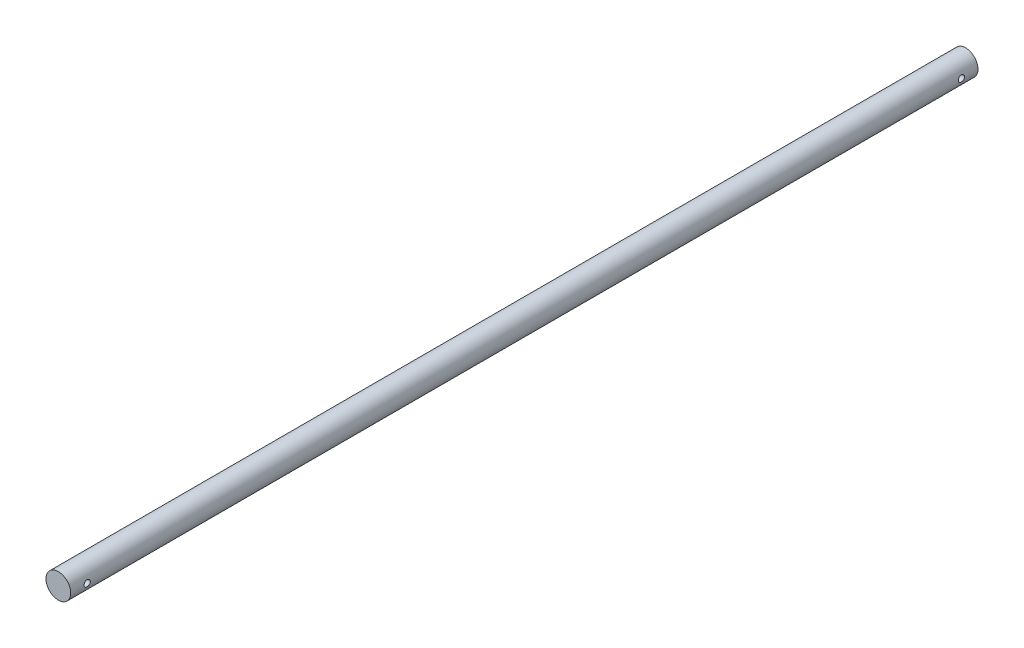
ISO-10303-21;
HEADER;
FILE_DESCRIPTION(('STEP AP214'),'2;1');
FILE_NAME('part.step','',(''),(''),'','','');
FILE_SCHEMA(('AUTOMOTIVE_DESIGN { 1 0 10303 214 1 1 1 1 }'));
ENDSEC;
DATA;
#1=APPLICATION_CONTEXT('core data for automotive mechanical design processes');
#2=APPLICATION_PROTOCOL_DEFINITION('international standard','automotive_design',2000,#1);
#3=PRODUCT_CONTEXT('',#1,'mechanical');
#4=PRODUCT('Part','Part','',(#3));
#5=PRODUCT_RELATED_PRODUCT_CATEGORY('part','',(#4));
#6=PRODUCT_DEFINITION_FORMATION('','',#4);
#7=PRODUCT_DEFINITION_CONTEXT('part definition',#1,'design');
#8=PRODUCT_DEFINITION('design','',#6,#7);
#9=PRODUCT_DEFINITION_SHAPE('','',#8);
#10=(LENGTH_UNIT() NAMED_UNIT(*) SI_UNIT(.MILLI.,.METRE.));
#11=(NAMED_UNIT(*) PLANE_ANGLE_UNIT() SI_UNIT($,.RADIAN.));
#12=(NAMED_UNIT(*) SI_UNIT($,.STERADIAN.) SOLID_ANGLE_UNIT());
#13=UNCERTAINTY_MEASURE_WITH_UNIT(LENGTH_MEASURE(1.E-05),#10,'distance_accuracy_value','');
#14=(GEOMETRIC_REPRESENTATION_CONTEXT(3) GLOBAL_UNCERTAINTY_ASSIGNED_CONTEXT((#13)) GLOBAL_UNIT_ASSIGNED_CONTEXT((#10,
#11,#12)) REPRESENTATION_CONTEXT('',''));
#15=CARTESIAN_POINT('',(0.,0.,0.));
#16=DIRECTION('',(0.,0.,1.));
#17=DIRECTION('',(1.,0.,0.));
#18=AXIS2_PLACEMENT_3D('',#15,#16,#17);
#19=CARTESIAN_POINT('',(0.,0.,220.));
#20=DIRECTION('',(0.,0.,-1.));
#21=DIRECTION('',(-1.,0.,0.));
#22=AXIS2_PLACEMENT_3D('',#19,#20,#21);
#23=CYLINDRICAL_SURFACE('',#22,3.);
#24=CARTESIAN_POINT('',(-3.,0.,4.74999999999995));
#25=CARTESIAN_POINT('',(-2.99999929934006,-0.041438044334868,4.74999883713087));
#26=CARTESIAN_POINT('',(-2.99913289065914,-0.0828890789153865,4.74655422461309));
#27=CARTESIAN_POINT('',(-2.99576056914946,-0.164603161885271,4.73288742434651));
#28=CARTESIAN_POINT('',(-2.99325372709984,-0.204865523435372,4.72266139523108));
#29=CARTESIAN_POINT('',(-2.9868781316602,-0.283010436091287,4.69578037326895));
#30=CARTESIAN_POINT('',(-2.98301101421043,-0.320895781715,4.67913310064236));
#31=CARTESIAN_POINT('',(-2.97432671903797,-0.393336065952212,4.63990930497759));
#32=CARTESIAN_POINT('',(-2.96950950927025,-0.427890892174379,4.61733258194053));
#33=CARTESIAN_POINT('',(-2.95933706795901,-0.49340096365046,4.56639960517289));
#34=CARTESIAN_POINT('',(-2.95397353574266,-0.524277845030537,4.53794421252041));
#35=CARTESIAN_POINT('',(-2.94336810058765,-0.580874463601653,4.47627389754554));
#36=CARTESIAN_POINT('',(-2.93812621144174,-0.606593618474568,4.44305843852675));
#37=CARTESIAN_POINT('',(-2.92827387849855,-0.652513271399516,4.37220238663128));
#38=CARTESIAN_POINT('',(-2.92367397235303,-0.672626107962678,4.3345033845948));
#39=CARTESIAN_POINT('',(-2.91574747406112,-0.706198454275264,4.25612579417082));
#40=CARTESIAN_POINT('',(-2.91242067836394,-0.719659027719666,4.21544768333712));
#41=CARTESIAN_POINT('',(-2.90750238358775,-0.739277418402145,4.13312825089876));
#42=CARTESIAN_POINT('',(-2.90587745537713,-0.745576134166669,4.0915225519751));
#43=CARTESIAN_POINT('',(-2.9044468126887,-0.751130887533926,4.00781571549301));
#44=CARTESIAN_POINT('',(-2.90464080224322,-0.750388070908989,3.96571465965069));
#45=CARTESIAN_POINT('',(-2.90679602748309,-0.74199326231964,3.88329209612776));
#46=CARTESIAN_POINT('',(-2.9087143150094,-0.73450917009526,3.84295218926745));
#47=CARTESIAN_POINT('',(-2.91403354838242,-0.713112093451554,3.76411947454435));
#48=CARTESIAN_POINT('',(-2.91743459985348,-0.699198651034712,3.72562679848551));
#49=CARTESIAN_POINT('',(-2.92537556952093,-0.665194738968577,3.65113099187397));
#50=CARTESIAN_POINT('',(-2.92992663734711,-0.645043333616456,3.61515691410522));
#51=CARTESIAN_POINT('',(-2.93964855423193,-0.599178138007478,3.54704064512158));
#52=CARTESIAN_POINT('',(-2.94481951167368,-0.57346337440442,3.51489912596637));
#53=CARTESIAN_POINT('',(-2.95537940269891,-0.516331712340609,3.4543981921528));
#54=CARTESIAN_POINT('',(-2.96077034738986,-0.48477312908293,3.42617275496933));
#55=CARTESIAN_POINT('',(-2.97102982789393,-0.41730595875185,3.37538937876805));
#56=CARTESIAN_POINT('',(-2.97589834774708,-0.381397238853972,3.35283161286822));
#57=CARTESIAN_POINT('',(-2.98458866047091,-0.306057944340696,3.31397470688781));
#58=CARTESIAN_POINT('',(-2.98840680063863,-0.266615696604312,3.29769732987279));
#59=CARTESIAN_POINT('',(-2.99453958495709,-0.185438004071442,3.27204134714521));
#60=CARTESIAN_POINT('',(-2.99685451669641,-0.143702999575243,3.26266142179093));
#61=CARTESIAN_POINT('',(-2.99967749635687,-0.0602699851950137,3.25127121722058));
#62=CARTESIAN_POINT('',(-3.00023026754139,-0.0185983599941051,3.24907848696235));
#63=CARTESIAN_POINT('',(-2.99959402407225,0.0645164374007539,3.25162450102774));
#64=CARTESIAN_POINT('',(-2.99840516620923,0.105959629822297,3.25636262139957));
#65=CARTESIAN_POINT('',(-2.99444790563679,0.186807134388246,3.27248545419569));
#66=CARTESIAN_POINT('',(-2.99170317092906,0.226232559484377,3.28377063173849));
#67=CARTESIAN_POINT('',(-2.98494353317067,0.302628646226255,3.31255354201422));
#68=CARTESIAN_POINT('',(-2.98092850184946,0.339599059516317,3.33005190215658));
#69=CARTESIAN_POINT('',(-2.97196653963155,0.410761567214924,3.37111806443736));
#70=CARTESIAN_POINT('',(-2.96700433683466,0.444892720917915,3.39478805619838));
#71=CARTESIAN_POINT('',(-2.9567225459371,0.508763306821623,3.44739495439848));
#72=CARTESIAN_POINT('',(-2.95140289625852,0.538501979486504,3.47633276980845));
#73=CARTESIAN_POINT('',(-2.94084478480386,0.593495284036365,3.53950098042223));
#74=CARTESIAN_POINT('',(-2.93561152093641,0.618621933811016,3.57384385150121));
#75=CARTESIAN_POINT('',(-2.92596439188619,0.662755379506349,3.64636631723286));
#76=CARTESIAN_POINT('',(-2.92155049033513,0.681762447078968,3.68454574147988));
#77=CARTESIAN_POINT('',(-2.91409047367333,0.712975710304646,3.76345286120654));
#78=CARTESIAN_POINT('',(-2.91103627645953,0.725222198327033,3.804163814172));
#79=CARTESIAN_POINT('',(-2.90663372045092,0.74267282997689,3.88715481894455));
#80=CARTESIAN_POINT('',(-2.90528498859968,0.747878513739329,3.92943452551624));
#81=CARTESIAN_POINT('',(-2.90447450601978,0.751019295166998,4.0130605119276));
#82=CARTESIAN_POINT('',(-2.90495966364132,0.749158948890059,4.05439871756236));
#83=CARTESIAN_POINT('',(-2.90763954503921,0.738688639156434,4.13615194433399));
#84=CARTESIAN_POINT('',(-2.90983423445928,0.730078811343385,4.17656698400682));
#85=CARTESIAN_POINT('',(-2.91565630341361,0.706465659721397,4.2551042295327));
#86=CARTESIAN_POINT('',(-2.91927507618155,0.691500702340188,4.2932386526201));
#87=CARTESIAN_POINT('',(-2.92753877862414,0.655632456802535,4.36648269135685));
#88=CARTESIAN_POINT('',(-2.93218385060387,0.634728345017094,4.40159188659346));
#89=CARTESIAN_POINT('',(-2.94212817131756,0.586933874318568,4.46877731450101));
#90=CARTESIAN_POINT('',(-2.94744132415878,0.559901581456128,4.50075053671198));
#91=CARTESIAN_POINT('',(-2.95804013623143,0.500894685594868,4.5597735223977));
#92=CARTESIAN_POINT('',(-2.9633257886353,0.468918910630573,4.58682211505648));
#93=CARTESIAN_POINT('',(-2.97338827823832,0.400233793351294,4.6357056542823));
#94=CARTESIAN_POINT('',(-2.97815416682934,0.363449211158192,4.65743730683579));
#95=CARTESIAN_POINT('',(-2.98652462487559,0.286633029755236,4.69437373147027));
#96=CARTESIAN_POINT('',(-2.99013002599891,0.246603781718369,4.70958318032426));
#97=CARTESIAN_POINT('',(-2.99524029782771,0.172205126621737,4.73078591516483));
#98=CARTESIAN_POINT('',(-2.99701292526345,0.138190085454038,4.73797562152673));
#99=CARTESIAN_POINT('',(-2.99939302615974,0.0694530357681454,4.74758297181096));
#100=CARTESIAN_POINT('',(-3.00000058725447,0.03473108062131,4.7500009746526));
#101=CARTESIAN_POINT('',(-3.,0.,4.74999999999995));
#102=B_SPLINE_CURVE_WITH_KNOTS('',3,(#24,#25,#26,#27,#28,#29,#30,#31,#32,#33,#34,#35,#36,#37,
#38,#39,#40,#41,#42,#43,#44,#45,#46,#47,#48,#49,#50,#51,#52,#53,#54,#55,#56,#57,#58,#59,#60,#61,
#62,#63,#64,#65,#66,#67,#68,#69,#70,#71,#72,#73,#74,#75,#76,#77,#78,#79,#80,#81,#82,#83,#84,#85,
#86,#87,#88,#89,#90,#91,#92,#93,#94,#95,#96,#97,#98,#99,#100,#101),.UNSPECIFIED.,.T.,.F.,(4,2,2,
2,2,2,2,2,2,2,2,2,2,2,2,2,2,2,2,2,2,2,2,2,2,2,2,2,2,2,2,2,2,2,2,2,2,2,4),(0.,0.124186856235947,
0.248444118881946,0.372552451143046,0.49666497008466,0.623072177185692,0.749493647900305,
0.877793237729029,1.00607230584684,1.13178147549715,1.25747019056348,1.38011248503509,
1.50276351733019,1.62665263936939,1.75056345418081,1.87800750484509,2.00545544779123,
2.13334114504557,2.26120236844321,2.38579154474638,2.51036950556371,2.63310137257018,
2.75584563661145,2.88076793782676,3.00571181504009,3.13372254602238,3.26172759374754,
3.38896127307018,3.51616711626203,3.63971890199306,3.76326820478017,3.88608200279723,
4.0089128406845,4.13494788204954,4.26101284885208,4.38936092749794,4.51761681910675,
4.62171121471074,4.72579778021519),.UNSPECIFIED.);
#103=CARTESIAN_POINT('',(-3.,0.,4.74999999999995));
#104=VERTEX_POINT('',#103);
#105=EDGE_CURVE('E10',#104,#104,#102,.T.);
#106=ORIENTED_EDGE('',*,*,#105,.T.);
#107=EDGE_LOOP('',(#106));
#108=FACE_BOUND('',#107,.T.);
#109=CARTESIAN_POINT('',(3.,0.,3.25));
#110=CARTESIAN_POINT('',(2.99999929934006,-0.0414380443348656,3.25000116286908));
#111=CARTESIAN_POINT('',(2.99913289065914,-0.0828890789153817,3.25344577538689));
#112=CARTESIAN_POINT('',(2.99576056914946,-0.164603161885266,3.2671125756535));
#113=CARTESIAN_POINT('',(2.99325372709984,-0.20486552343537,3.27733860476892));
#114=CARTESIAN_POINT('',(2.9868781316602,-0.283010436091289,3.30421962673104));
#115=CARTESIAN_POINT('',(2.98301101421043,-0.320895781715002,3.32086689935764));
#116=CARTESIAN_POINT('',(2.97432671903797,-0.393336065952213,3.36009069502242));
#117=CARTESIAN_POINT('',(2.96950950927025,-0.42789089217438,3.38266741805947));
#118=CARTESIAN_POINT('',(2.95933706795901,-0.49340096365046,3.43360039482711));
#119=CARTESIAN_POINT('',(2.95397353574266,-0.524277845030536,3.46205578747959));
#120=CARTESIAN_POINT('',(2.94336810058765,-0.580874463601652,3.52372610245446));
#121=CARTESIAN_POINT('',(2.93812621144174,-0.606593618474568,3.55694156147325));
#122=CARTESIAN_POINT('',(2.92827387849855,-0.652513271399516,3.62779761336872));
#123=CARTESIAN_POINT('',(2.92367397235303,-0.672626107962679,3.6654966154052));
#124=CARTESIAN_POINT('',(2.91574747406112,-0.706198454275264,3.74387420582918));
#125=CARTESIAN_POINT('',(2.91242067836394,-0.719659027719667,3.78455231666288));
#126=CARTESIAN_POINT('',(2.90750238358775,-0.739277418402145,3.86687174910124));
#127=CARTESIAN_POINT('',(2.90587745537713,-0.745576134166669,3.9084774480249));
#128=CARTESIAN_POINT('',(2.9044468126887,-0.751130887533926,3.99218428450699));
#129=CARTESIAN_POINT('',(2.90464080224322,-0.750388070908989,4.03428534034931));
#130=CARTESIAN_POINT('',(2.90679602748309,-0.741993262319641,4.11670790387224));
#131=CARTESIAN_POINT('',(2.9087143150094,-0.73450917009526,4.15704781073255));
#132=CARTESIAN_POINT('',(2.91403354838242,-0.713112093451553,4.23588052545565));
#133=CARTESIAN_POINT('',(2.91743459985348,-0.699198651034712,4.27437320151449));
#134=CARTESIAN_POINT('',(2.92537556952093,-0.665194738968577,4.34886900812603));
#135=CARTESIAN_POINT('',(2.92992663734711,-0.645043333616455,4.38484308589478));
#136=CARTESIAN_POINT('',(2.93964855423193,-0.599178138007477,4.45295935487842));
#137=CARTESIAN_POINT('',(2.94481951167368,-0.57346337440442,4.48510087403363));
#138=CARTESIAN_POINT('',(2.9553794026989,-0.516331712340609,4.5456018078472));
#139=CARTESIAN_POINT('',(2.96077034738986,-0.48477312908293,4.57382724503068));
#140=CARTESIAN_POINT('',(2.97102982789393,-0.41730595875185,4.62461062123195));
#141=CARTESIAN_POINT('',(2.97589834774708,-0.381397238853972,4.64716838713178));
#142=CARTESIAN_POINT('',(2.98458866047091,-0.306057944340696,4.68602529311219));
#143=CARTESIAN_POINT('',(2.98840680063863,-0.266615696604312,4.70230267012721));
#144=CARTESIAN_POINT('',(2.99453958495709,-0.185438004071441,4.72795865285479));
#145=CARTESIAN_POINT('',(2.99685451669641,-0.143702999575242,4.73733857820907));
#146=CARTESIAN_POINT('',(2.99967749635687,-0.0602699851950134,4.74872878277942));
#147=CARTESIAN_POINT('',(3.00023026754139,-0.0185983599941048,4.75092151303765));
#148=CARTESIAN_POINT('',(2.99959402407225,0.0645164374007542,4.74837549897226));
#149=CARTESIAN_POINT('',(2.99840516620923,0.105959629822298,4.74363737860043));
#150=CARTESIAN_POINT('',(2.99444790563679,0.186807134388246,4.72751454580431));
#151=CARTESIAN_POINT('',(2.99170317092906,0.226232559484378,4.71622936826151));
#152=CARTESIAN_POINT('',(2.98494353317067,0.302628646226256,4.68744645798578));
#153=CARTESIAN_POINT('',(2.98092850184946,0.339599059516318,4.66994809784341));
#154=CARTESIAN_POINT('',(2.97196653963155,0.410761567214924,4.62888193556264));
#155=CARTESIAN_POINT('',(2.96700433683466,0.444892720917915,4.60521194380162));
#156=CARTESIAN_POINT('',(2.9567225459371,0.508763306821623,4.55260504560152));
#157=CARTESIAN_POINT('',(2.95140289625852,0.538501979486504,4.52366723019155));
#158=CARTESIAN_POINT('',(2.94084478480386,0.593495284036365,4.46049901957777));
#159=CARTESIAN_POINT('',(2.93561152093641,0.618621933811016,4.42615614849879));
#160=CARTESIAN_POINT('',(2.92596439188619,0.662755379506349,4.35363368276714));
#161=CARTESIAN_POINT('',(2.92155049033513,0.681762447078968,4.31545425852012));
#162=CARTESIAN_POINT('',(2.91409047367333,0.712975710304646,4.23654713879346));
#163=CARTESIAN_POINT('',(2.91103627645953,0.725222198327033,4.195836185828));
#164=CARTESIAN_POINT('',(2.90663372045092,0.74267282997689,4.11284518105545));
#165=CARTESIAN_POINT('',(2.90528498859968,0.747878513739329,4.07056547448376));
#166=CARTESIAN_POINT('',(2.90447450601978,0.751019295166997,3.9869394880724));
#167=CARTESIAN_POINT('',(2.90495966364132,0.749158948890059,3.94560128243763));
#168=CARTESIAN_POINT('',(2.90763954503921,0.738688639156434,3.86384805566601));
#169=CARTESIAN_POINT('',(2.90983423445928,0.730078811343385,3.82343301599317));
#170=CARTESIAN_POINT('',(2.91565630341361,0.706465659721397,3.7448957704673));
#171=CARTESIAN_POINT('',(2.91927507618155,0.691500702340188,3.7067613473799));
#172=CARTESIAN_POINT('',(2.92753877862414,0.655632456802535,3.63351730864315));
#173=CARTESIAN_POINT('',(2.93218385060387,0.634728345017094,3.59840811340654));
#174=CARTESIAN_POINT('',(2.94212817131756,0.586933874318568,3.53122268549899));
#175=CARTESIAN_POINT('',(2.94744132415879,0.559901581456127,3.49924946328802));
#176=CARTESIAN_POINT('',(2.95804013623143,0.500894685594868,3.4402264776023));
#177=CARTESIAN_POINT('',(2.9633257886353,0.468918910630573,3.41317788494352));
#178=CARTESIAN_POINT('',(2.97338827823831,0.400233793351295,3.3642943457177));
#179=CARTESIAN_POINT('',(2.97815416682934,0.363449211158193,3.34256269316421));
#180=CARTESIAN_POINT('',(2.98652462487559,0.286633029755237,3.30562626852973));
#181=CARTESIAN_POINT('',(2.99013002599891,0.246603781718369,3.29041681967573));
#182=CARTESIAN_POINT('',(2.99524029782771,0.172205126621736,3.26921408483517));
#183=CARTESIAN_POINT('',(2.99701292526345,0.138190085454034,3.26202437847328));
#184=CARTESIAN_POINT('',(2.99939302615974,0.0694530357681415,3.25241702818903));
#185=CARTESIAN_POINT('',(3.00000058725447,0.0347310806213081,3.24999902534735));
#186=CARTESIAN_POINT('',(3.,0.,3.25));
#187=B_SPLINE_CURVE_WITH_KNOTS('',3,(#109,#110,#111,#112,#113,#114,#115,#116,#117,#118,#119,
#120,#121,#122,#123,#124,#125,#126,#127,#128,#129,#130,#131,#132,#133,#134,#135,#136,#137,#138,
#139,#140,#141,#142,#143,#144,#145,#146,#147,#148,#149,#150,#151,#152,#153,#154,#155,#156,#157,
#158,#159,#160,#161,#162,#163,#164,#165,#166,#167,#168,#169,#170,#171,#172,#173,#174,#175,#176,
#177,#178,#179,#180,#181,#182,#183,#184,#185,#186),.UNSPECIFIED.,.T.,.F.,(4,2,2,2,2,2,2,2,2,2,2,
2,2,2,2,2,2,2,2,2,2,2,2,2,2,2,2,2,2,2,2,2,2,2,2,2,2,2,4),(0.,0.124186856235945,0.24844411888195,
0.372552451143053,0.496664970084664,0.623072177185696,0.74949364790031,0.877793237729035,
1.00607230584684,1.13178147549715,1.25747019056348,1.38011248503509,1.50276351733019,
1.6266526393694,1.75056345418081,1.8780075048451,2.00545544779124,2.13334114504557,
2.26120236844321,2.38579154474638,2.51036950556371,2.63310137257019,2.75584563661145,
2.88076793782676,3.0057118150401,3.13372254602238,3.26172759374754,3.38896127307018,
3.51616711626204,3.63971890199306,3.76326820478017,3.88608200279724,4.00891284068451,
4.13494788204955,4.26101284885209,4.38936092749794,4.51761681910675,4.62171121471075,
4.7257977802152),.UNSPECIFIED.);
#188=CARTESIAN_POINT('',(3.,0.,3.25));
#189=VERTEX_POINT('',#188);
#190=EDGE_CURVE('E49',#189,#189,#187,.T.);
#191=ORIENTED_EDGE('',*,*,#190,.T.);
#192=EDGE_LOOP('',(#191));
#193=FACE_BOUND('',#192,.T.);
#194=CARTESIAN_POINT('',(-3.,0.,216.75));
#195=CARTESIAN_POINT('',(-2.99999929934006,-0.0414380443348669,216.749998837131));
#196=CARTESIAN_POINT('',(-2.99913289065914,-0.0828890789153841,216.746554224613));
#197=CARTESIAN_POINT('',(-2.99576056914946,-0.16460316188527,216.732887424347));
#198=CARTESIAN_POINT('',(-2.99325372709984,-0.204865523435374,216.722661395231));
#199=CARTESIAN_POINT('',(-2.9868781316602,-0.283010436091293,216.695780373269));
#200=CARTESIAN_POINT('',(-2.98301101421043,-0.320895781715006,216.679133100642));
#201=CARTESIAN_POINT('',(-2.97432671903796,-0.393336065952223,216.639909304978));
#202=CARTESIAN_POINT('',(-2.96950950927025,-0.427890892174393,216.617332581941));
#203=CARTESIAN_POINT('',(-2.959337067959,-0.493400963650475,216.566399605173));
#204=CARTESIAN_POINT('',(-2.95397353574266,-0.52427784503055,216.53794421252));
#205=CARTESIAN_POINT('',(-2.94336810058764,-0.580874463601666,216.476273897546));
#206=CARTESIAN_POINT('',(-2.93812621144174,-0.606593618474581,216.443058438527));
#207=CARTESIAN_POINT('',(-2.92827387849855,-0.652513271399534,216.372202386631));
#208=CARTESIAN_POINT('',(-2.92367397235302,-0.6726261079627,216.334503384595));
#209=CARTESIAN_POINT('',(-2.91574747406111,-0.706198454275284,216.256125794171));
#210=CARTESIAN_POINT('',(-2.91242067836394,-0.719659027719681,216.215447683337));
#211=CARTESIAN_POINT('',(-2.90750238358775,-0.739277418402156,216.133128250899));
#212=CARTESIAN_POINT('',(-2.90587745537713,-0.745576134166681,216.091522551975));
#213=CARTESIAN_POINT('',(-2.9044468126887,-0.75113088753394,216.007815715493));
#214=CARTESIAN_POINT('',(-2.90464080224322,-0.750388070909,215.965714659651));
#215=CARTESIAN_POINT('',(-2.90679602748309,-0.741993262319646,215.883292096128));
#216=CARTESIAN_POINT('',(-2.9087143150094,-0.734509170095266,215.842952189267));
#217=CARTESIAN_POINT('',(-2.91403354838242,-0.71311209345156,215.764119474544));
#218=CARTESIAN_POINT('',(-2.91743459985348,-0.699198651034719,215.725626798486));
#219=CARTESIAN_POINT('',(-2.92537556952093,-0.665194738968589,215.651130991874));
#220=CARTESIAN_POINT('',(-2.9299266373471,-0.64504333361647,215.615156914105));
#221=CARTESIAN_POINT('',(-2.93964855423193,-0.599178138007485,215.547040645122));
#222=CARTESIAN_POINT('',(-2.94481951167368,-0.573463374404417,215.514899125966));
#223=CARTESIAN_POINT('',(-2.95537940269891,-0.516331712340596,215.454398192153));
#224=CARTESIAN_POINT('',(-2.96077034738986,-0.48477312908292,215.426172754969));
#225=CARTESIAN_POINT('',(-2.97102982789393,-0.417305958751839,215.375389378768));
#226=CARTESIAN_POINT('',(-2.97589834774708,-0.381397238853958,215.352831612868));
#227=CARTESIAN_POINT('',(-2.98458866047091,-0.306057944340681,215.313974706888));
#228=CARTESIAN_POINT('',(-2.98840680063863,-0.266615696604298,215.297697329873));
#229=CARTESIAN_POINT('',(-2.99453958495709,-0.185438004071429,215.272041347145));
#230=CARTESIAN_POINT('',(-2.99685451669641,-0.14370299957523,215.262661421791));
#231=CARTESIAN_POINT('',(-2.99967749635687,-0.060269985195001,215.251271217221));
#232=CARTESIAN_POINT('',(-3.00023026754139,-0.0185983599940925,215.249078486962));
#233=CARTESIAN_POINT('',(-2.99959402407225,0.0645164374007664,215.251624501028));
#234=CARTESIAN_POINT('',(-2.99840516620923,0.10595962982231,215.2563626214));
#235=CARTESIAN_POINT('',(-2.99444790563678,0.186807134388258,215.272485454196));
#236=CARTESIAN_POINT('',(-2.99170317092906,0.22623255948439,215.283770631738));
#237=CARTESIAN_POINT('',(-2.98494353317067,0.30262864622627,215.312553542014));
#238=CARTESIAN_POINT('',(-2.98092850184946,0.339599059516333,215.330051902157));
#239=CARTESIAN_POINT('',(-2.97196653963155,0.410761567214935,215.371118064437));
#240=CARTESIAN_POINT('',(-2.96700433683466,0.444892720917922,215.394788056198));
#241=CARTESIAN_POINT('',(-2.9567225459371,0.50876330682163,215.447394954398));
#242=CARTESIAN_POINT('',(-2.95140289625852,0.538501979486515,215.476332769808));
#243=CARTESIAN_POINT('',(-2.94084478480385,0.593495284036376,215.539500980422));
#244=CARTESIAN_POINT('',(-2.9356115209364,0.618621933811024,215.573843851501));
#245=CARTESIAN_POINT('',(-2.92596439188619,0.662755379506358,215.646366317233));
#246=CARTESIAN_POINT('',(-2.92155049033513,0.681762447078978,215.68454574148));
#247=CARTESIAN_POINT('',(-2.91409047367332,0.712975710304661,215.763452861207));
#248=CARTESIAN_POINT('',(-2.91103627645952,0.72522219832705,215.804163814172));
#249=CARTESIAN_POINT('',(-2.90663372045091,0.742672829976903,215.887154818945));
#250=CARTESIAN_POINT('',(-2.90528498859968,0.747878513739341,215.929434525516));
#251=CARTESIAN_POINT('',(-2.90447450601978,0.75101929516701,216.013060511928));
#252=CARTESIAN_POINT('',(-2.90495966364132,0.749158948890071,216.054398717562));
#253=CARTESIAN_POINT('',(-2.90763954503921,0.738688639156444,216.136151944334));
#254=CARTESIAN_POINT('',(-2.90983423445928,0.730078811343396,216.176566984007));
#255=CARTESIAN_POINT('',(-2.91565630341361,0.706465659721407,216.255104229533));
#256=CARTESIAN_POINT('',(-2.91927507618155,0.691500702340193,216.29323865262));
#257=CARTESIAN_POINT('',(-2.92753877862414,0.655632456802536,216.366482691357));
#258=CARTESIAN_POINT('',(-2.93218385060387,0.634728345017095,216.401591886594));
#259=CARTESIAN_POINT('',(-2.94212817131756,0.586933874318565,216.468777314501));
#260=CARTESIAN_POINT('',(-2.94744132415879,0.559901581456121,216.500750536712));
#261=CARTESIAN_POINT('',(-2.95804013623143,0.500894685594862,216.559773522398));
#262=CARTESIAN_POINT('',(-2.9633257886353,0.468918910630569,216.586822115056));
#263=CARTESIAN_POINT('',(-2.97338827823832,0.400233793351289,216.635705654282));
#264=CARTESIAN_POINT('',(-2.97815416682934,0.363449211158182,216.657437306836));
#265=CARTESIAN_POINT('',(-2.98652462487559,0.286633029755223,216.69437373147));
#266=CARTESIAN_POINT('',(-2.99013002599891,0.246603781718359,216.709583180324));
#267=CARTESIAN_POINT('',(-2.99524029782771,0.172205126621731,216.730785915165));
#268=CARTESIAN_POINT('',(-2.99701292526345,0.138190085454032,216.737975621527));
#269=CARTESIAN_POINT('',(-2.99939302615974,0.0694530357681419,216.747582971811));
#270=CARTESIAN_POINT('',(-3.00000058725447,0.0347310806213082,216.750000974653));
#271=CARTESIAN_POINT('',(-3.,0.,216.75));
#272=B_SPLINE_CURVE_WITH_KNOTS('',3,(#194,#195,#196,#197,#198,#199,#200,#201,#202,#203,#204,
#205,#206,#207,#208,#209,#210,#211,#212,#213,#214,#215,#216,#217,#218,#219,#220,#221,#222,#223,
#224,#225,#226,#227,#228,#229,#230,#231,#232,#233,#234,#235,#236,#237,#238,#239,#240,#241,#242,
#243,#244,#245,#246,#247,#248,#249,#250,#251,#252,#253,#254,#255,#256,#257,#258,#259,#260,#261,
#262,#263,#264,#265,#266,#267,#268,#269,#270,#271),.UNSPECIFIED.,.T.,.F.,(4,2,2,2,2,2,2,2,2,2,2,
2,2,2,2,2,2,2,2,2,2,2,2,2,2,2,2,2,2,2,2,2,2,2,2,2,2,2,4),(0.,0.124186856235946,
0.248444118881959,0.372552451143054,0.496664970084675,0.6230721771857,0.749493647900341,
0.877793237729075,1.00607230584687,1.13178147549716,1.25747019056353,1.38011248503514,
1.50276351733021,1.62665263936942,1.75056345418087,1.87800750484515,2.00545544779128,
2.13334114504562,2.26120236844326,2.38579154474643,2.51036950556377,2.63310137257024,
2.75584563661151,2.8807679378268,3.00571181504015,3.13372254602242,3.2617275937476,
3.38896127307029,3.51616711626209,3.63971890199312,3.76326820478022,3.88608200279732,
4.00891284068461,4.13494788204963,4.26101284885217,4.38936092749804,4.51761681910684,
4.62171121471083,4.72579778021528),.UNSPECIFIED.);
#273=CARTESIAN_POINT('',(-3.,0.,216.75));
#274=VERTEX_POINT('',#273);
#275=EDGE_CURVE('E54',#274,#274,#272,.T.);
#276=ORIENTED_EDGE('',*,*,#275,.T.);
#277=EDGE_LOOP('',(#276));
#278=FACE_BOUND('',#277,.T.);
#279=CARTESIAN_POINT('',(3.,0.,215.25));
#280=CARTESIAN_POINT('',(2.99999929934006,-0.0414380443348668,215.250001162869));
#281=CARTESIAN_POINT('',(2.99913289065914,-0.0828890789153841,215.253445775387));
#282=CARTESIAN_POINT('',(2.99576056914946,-0.16460316188527,215.267112575653));
#283=CARTESIAN_POINT('',(2.99325372709984,-0.204865523435374,215.277338604769));
#284=CARTESIAN_POINT('',(2.9868781316602,-0.283010436091293,215.304219626731));
#285=CARTESIAN_POINT('',(2.98301101421043,-0.320895781715006,215.320866899358));
#286=CARTESIAN_POINT('',(2.97432671903796,-0.393336065952223,215.360090695022));
#287=CARTESIAN_POINT('',(2.96950950927025,-0.427890892174393,215.382667418059));
#288=CARTESIAN_POINT('',(2.959337067959,-0.493400963650475,215.433600394827));
#289=CARTESIAN_POINT('',(2.95397353574266,-0.52427784503055,215.46205578748));
#290=CARTESIAN_POINT('',(2.94336810058764,-0.580874463601666,215.523726102454));
#291=CARTESIAN_POINT('',(2.93812621144174,-0.606593618474581,215.556941561473));
#292=CARTESIAN_POINT('',(2.92827387849855,-0.652513271399534,215.627797613369));
#293=CARTESIAN_POINT('',(2.92367397235302,-0.6726261079627,215.665496615405));
#294=CARTESIAN_POINT('',(2.91574747406111,-0.706198454275284,215.743874205829));
#295=CARTESIAN_POINT('',(2.91242067836394,-0.719659027719681,215.784552316663));
#296=CARTESIAN_POINT('',(2.90750238358775,-0.739277418402156,215.866871749101));
#297=CARTESIAN_POINT('',(2.90587745537713,-0.745576134166681,215.908477448025));
#298=CARTESIAN_POINT('',(2.9044468126887,-0.75113088753394,215.992184284507));
#299=CARTESIAN_POINT('',(2.90464080224322,-0.750388070909,216.034285340349));
#300=CARTESIAN_POINT('',(2.90679602748309,-0.741993262319646,216.116707903872));
#301=CARTESIAN_POINT('',(2.9087143150094,-0.734509170095266,216.157047810733));
#302=CARTESIAN_POINT('',(2.91403354838242,-0.71311209345156,216.235880525456));
#303=CARTESIAN_POINT('',(2.91743459985348,-0.699198651034719,216.274373201514));
#304=CARTESIAN_POINT('',(2.92537556952093,-0.665194738968589,216.348869008126));
#305=CARTESIAN_POINT('',(2.9299266373471,-0.64504333361647,216.384843085895));
#306=CARTESIAN_POINT('',(2.93964855423193,-0.599178138007485,216.452959354878));
#307=CARTESIAN_POINT('',(2.94481951167368,-0.573463374404418,216.485100874034));
#308=CARTESIAN_POINT('',(2.95537940269891,-0.516331712340592,216.545601807847));
#309=CARTESIAN_POINT('',(2.96077034738986,-0.48477312908291,216.573827245031));
#310=CARTESIAN_POINT('',(2.97102982789393,-0.417305958751829,216.624610621232));
#311=CARTESIAN_POINT('',(2.97589834774708,-0.381397238853954,216.647168387132));
#312=CARTESIAN_POINT('',(2.98458866047091,-0.306057944340682,216.686025293112));
#313=CARTESIAN_POINT('',(2.98840680063863,-0.266615696604298,216.702302670127));
#314=CARTESIAN_POINT('',(2.99453958495709,-0.185438004071428,216.727958652855));
#315=CARTESIAN_POINT('',(2.99685451669641,-0.14370299957523,216.737338578209));
#316=CARTESIAN_POINT('',(2.99967749635687,-0.0602699851950011,216.748728782779));
#317=CARTESIAN_POINT('',(3.00023026754139,-0.0185983599940925,216.750921513038));
#318=CARTESIAN_POINT('',(2.99959402407225,0.0645164374007665,216.748375498972));
#319=CARTESIAN_POINT('',(2.99840516620923,0.10595962982231,216.7436373786));
#320=CARTESIAN_POINT('',(2.99444790563678,0.186807134388259,216.727514545804));
#321=CARTESIAN_POINT('',(2.99170317092906,0.22623255948439,216.716229368262));
#322=CARTESIAN_POINT('',(2.98494353317067,0.30262864622627,216.687446457986));
#323=CARTESIAN_POINT('',(2.98092850184946,0.339599059516333,216.669948097843));
#324=CARTESIAN_POINT('',(2.97196653963155,0.410761567214935,216.628881935563));
#325=CARTESIAN_POINT('',(2.96700433683466,0.444892720917922,216.605211943802));
#326=CARTESIAN_POINT('',(2.9567225459371,0.50876330682163,216.552605045602));
#327=CARTESIAN_POINT('',(2.95140289625852,0.538501979486515,216.523667230192));
#328=CARTESIAN_POINT('',(2.94084478480385,0.593495284036376,216.460499019578));
#329=CARTESIAN_POINT('',(2.9356115209364,0.618621933811024,216.426156148499));
#330=CARTESIAN_POINT('',(2.92596439188619,0.662755379506358,216.353633682767));
#331=CARTESIAN_POINT('',(2.92155049033513,0.681762447078978,216.31545425852));
#332=CARTESIAN_POINT('',(2.91409047367332,0.712975710304658,216.236547138793));
#333=CARTESIAN_POINT('',(2.91103627645953,0.725222198327045,216.195836185828));
#334=CARTESIAN_POINT('',(2.90663372045092,0.742672829976901,216.112845181055));
#335=CARTESIAN_POINT('',(2.90528498859968,0.747878513739341,216.070565474484));
#336=CARTESIAN_POINT('',(2.90447450601978,0.75101929516701,215.986939488072));
#337=CARTESIAN_POINT('',(2.90495966364132,0.749158948890071,215.945601282438));
#338=CARTESIAN_POINT('',(2.90763954503921,0.738688639156448,215.863848055666));
#339=CARTESIAN_POINT('',(2.90983423445928,0.730078811343399,215.823433015993));
#340=CARTESIAN_POINT('',(2.91565630341361,0.706465659721407,215.744895770467));
#341=CARTESIAN_POINT('',(2.91927507618155,0.691500702340193,215.70676134738));
#342=CARTESIAN_POINT('',(2.92753877862414,0.655632456802536,215.633517308643));
#343=CARTESIAN_POINT('',(2.93218385060387,0.634728345017095,215.598408113406));
#344=CARTESIAN_POINT('',(2.94212817131756,0.586933874318564,215.531222685499));
#345=CARTESIAN_POINT('',(2.94744132415879,0.55990158145612,215.499249463288));
#346=CARTESIAN_POINT('',(2.95804013623143,0.500894685594862,215.440226477602));
#347=CARTESIAN_POINT('',(2.9633257886353,0.468918910630571,215.413177884943));
#348=CARTESIAN_POINT('',(2.97338827823831,0.400233793351299,215.364294345718));
#349=CARTESIAN_POINT('',(2.97815416682934,0.3634492111582,215.342562693164));
#350=CARTESIAN_POINT('',(2.98652462487559,0.286633029755244,215.30562626853));
#351=CARTESIAN_POINT('',(2.99013002599891,0.24660378171837,215.290416819676));
#352=CARTESIAN_POINT('',(2.99524029782771,0.172205126621732,215.269214084835));
#353=CARTESIAN_POINT('',(2.99701292526345,0.138190085454032,215.262024378473));
#354=CARTESIAN_POINT('',(2.99939302615974,0.0694530357681416,215.252417028189));
#355=CARTESIAN_POINT('',(3.00000058725447,0.0347310806213081,215.249999025347));
#356=CARTESIAN_POINT('',(3.,0.,215.25));
#357=B_SPLINE_CURVE_WITH_KNOTS('',3,(#279,#280,#281,#282,#283,#284,#285,#286,#287,#288,#289,
#290,#291,#292,#293,#294,#295,#296,#297,#298,#299,#300,#301,#302,#303,#304,#305,#306,#307,#308,
#309,#310,#311,#312,#313,#314,#315,#316,#317,#318,#319,#320,#321,#322,#323,#324,#325,#326,#327,
#328,#329,#330,#331,#332,#333,#334,#335,#336,#337,#338,#339,#340,#341,#342,#343,#344,#345,#346,
#347,#348,#349,#350,#351,#352,#353,#354,#355,#356),.UNSPECIFIED.,.T.,.F.,(4,2,2,2,2,2,2,2,2,2,2,
2,2,2,2,2,2,2,2,2,2,2,2,2,2,2,2,2,2,2,2,2,2,2,2,2,2,2,4),(0.,0.124186856235946,
0.248444118881959,0.372552451143054,0.496664970084675,0.6230721771857,0.749493647900341,
0.877793237729075,1.00607230584687,1.13178147549716,1.25747019056353,1.38011248503514,
1.50276351733021,1.62665263936942,1.75056345418087,1.87800750484516,2.00545544779128,
2.13334114504562,2.26120236844326,2.38579154474643,2.51036950556376,2.63310137257024,
2.75584563661151,2.8807679378268,3.00571181504015,3.13372254602242,3.2617275937476,
3.38896127307026,3.51616711626209,3.63971890199309,3.76326820478022,3.88608200279732,
4.00891284068461,4.13494788204963,4.26101284885217,4.389360927498,4.51761681910683,
4.62171121471082,4.72579778021527),.UNSPECIFIED.);
#358=CARTESIAN_POINT('',(3.,0.,215.25));
#359=VERTEX_POINT('',#358);
#360=EDGE_CURVE('E59',#359,#359,#357,.T.);
#361=ORIENTED_EDGE('',*,*,#360,.T.);
#362=EDGE_LOOP('',(#361));
#363=FACE_BOUND('',#362,.T.);
#364=CARTESIAN_POINT('',(0.,0.,220.));
#365=DIRECTION('',(0.,0.,1.));
#366=DIRECTION('',(1.,0.,0.));
#367=AXIS2_PLACEMENT_3D('',#364,#365,#366);
#368=CIRCLE('',#367,3.);
#369=CARTESIAN_POINT('',(3.,0.,220.));
#370=VERTEX_POINT('',#369);
#371=EDGE_CURVE('E88',#370,#370,#368,.T.);
#372=ORIENTED_EDGE('',*,*,#371,.F.);
#373=EDGE_LOOP('',(#372));
#374=FACE_BOUND('',#373,.T.);
#375=CARTESIAN_POINT('',(0.,0.,0.));
#376=DIRECTION('',(0.,0.,1.));
#377=DIRECTION('',(1.,0.,0.));
#378=AXIS2_PLACEMENT_3D('',#375,#376,#377);
#379=CIRCLE('',#378,3.);
#380=CARTESIAN_POINT('',(3.,0.,0.));
#381=VERTEX_POINT('',#380);
#382=EDGE_CURVE('E89',#381,#381,#379,.T.);
#383=ORIENTED_EDGE('',*,*,#382,.T.);
#384=EDGE_LOOP('',(#383));
#385=FACE_BOUND('',#384,.T.);
#386=ADVANCED_FACE('F37',(#108,#193,#278,#363,#374,#385),#23,.T.);
#387=CARTESIAN_POINT('',(0.,0.,220.));
#388=DIRECTION('',(0.,0.,1.));
#389=DIRECTION('',(1.,0.,0.));
#390=AXIS2_PLACEMENT_3D('',#387,#388,#389);
#391=PLANE('',#390);
#392=ORIENTED_EDGE('',*,*,#371,.T.);
#393=EDGE_LOOP('',(#392));
#394=FACE_BOUND('',#393,.T.);
#395=ADVANCED_FACE('F80',(#394),#391,.T.);
#396=CARTESIAN_POINT('',(0.,0.,0.));
#397=DIRECTION('',(0.,0.,1.));
#398=DIRECTION('',(1.,0.,0.));
#399=AXIS2_PLACEMENT_3D('',#396,#397,#398);
#400=PLANE('',#399);
#401=ORIENTED_EDGE('',*,*,#382,.F.);
#402=EDGE_LOOP('',(#401));
#403=FACE_BOUND('',#402,.T.);
#404=ADVANCED_FACE('F78',(#403),#400,.F.);
#405=CARTESIAN_POINT('',(-3.,0.,216.));
#406=DIRECTION('',(1.,0.,0.));
#407=DIRECTION('',(0.,0.,-1.));
#408=AXIS2_PLACEMENT_3D('',#405,#406,#407);
#409=CYLINDRICAL_SURFACE('',#408,0.750000000000012);
#410=ORIENTED_EDGE('',*,*,#360,.F.);
#411=EDGE_LOOP('',(#410));
#412=FACE_BOUND('',#411,.T.);
#413=ORIENTED_EDGE('',*,*,#275,.F.);
#414=EDGE_LOOP('',(#413));
#415=FACE_BOUND('',#414,.T.);
#416=ADVANCED_FACE('F72',(#412,#415),#409,.F.);
#417=CARTESIAN_POINT('',(-3.,0.,4.));
#418=DIRECTION('',(1.,0.,0.));
#419=DIRECTION('',(0.,0.,-1.));
#420=AXIS2_PLACEMENT_3D('',#417,#418,#419);
#421=CYLINDRICAL_SURFACE('',#420,0.75);
#422=ORIENTED_EDGE('',*,*,#190,.F.);
#423=EDGE_LOOP('',(#422));
#424=FACE_BOUND('',#423,.T.);
#425=ORIENTED_EDGE('',*,*,#105,.F.);
#426=EDGE_LOOP('',(#425));
#427=FACE_BOUND('',#426,.T.);
#428=ADVANCED_FACE('F69',(#424,#427),#421,.F.);
#429=CLOSED_SHELL('',(#386,#395,#404,#416,#428));
#430=MANIFOLD_SOLID_BREP('B2',#429);
#431=ADVANCED_BREP_SHAPE_REPRESENTATION('',(#18,#430),#14);
#432=SHAPE_DEFINITION_REPRESENTATION(#9,#431);
ENDSEC;
END-ISO-10303-21;
